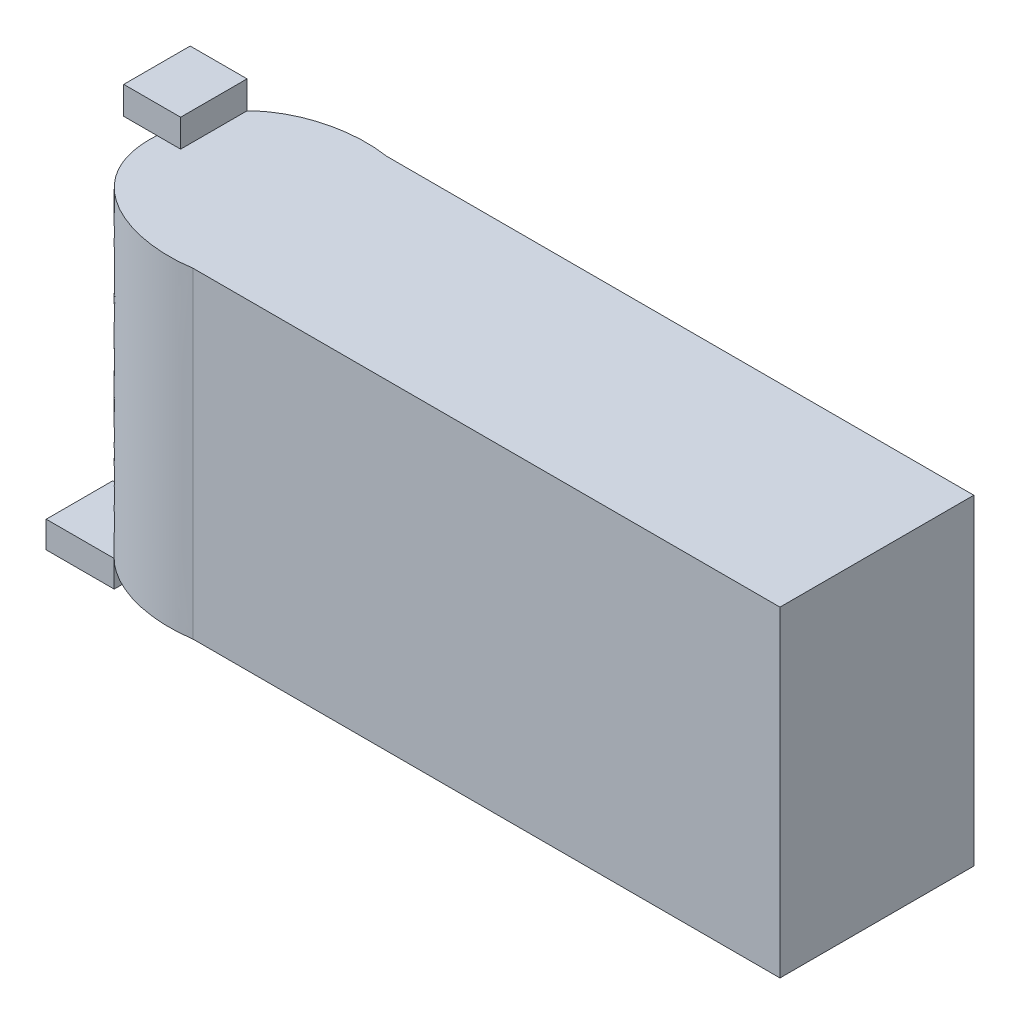
ISO-10303-21;
HEADER;
FILE_DESCRIPTION(('STEP AP214'),'2;1');
FILE_NAME('part.step','',(''),(''),'','','');
FILE_SCHEMA(('AUTOMOTIVE_DESIGN { 1 0 10303 214 1 1 1 1 }'));
ENDSEC;
DATA;
#1=APPLICATION_CONTEXT('core data for automotive mechanical design processes');
#2=APPLICATION_PROTOCOL_DEFINITION('international standard','automotive_design',2000,#1);
#3=PRODUCT_CONTEXT('',#1,'mechanical');
#4=PRODUCT('Part','Part','',(#3));
#5=PRODUCT_RELATED_PRODUCT_CATEGORY('part','',(#4));
#6=PRODUCT_DEFINITION_FORMATION('','',#4);
#7=PRODUCT_DEFINITION_CONTEXT('part definition',#1,'design');
#8=PRODUCT_DEFINITION('design','',#6,#7);
#9=PRODUCT_DEFINITION_SHAPE('','',#8);
#10=(LENGTH_UNIT() NAMED_UNIT(*) SI_UNIT(.MILLI.,.METRE.));
#11=(NAMED_UNIT(*) PLANE_ANGLE_UNIT() SI_UNIT($,.RADIAN.));
#12=(NAMED_UNIT(*) SI_UNIT($,.STERADIAN.) SOLID_ANGLE_UNIT());
#13=UNCERTAINTY_MEASURE_WITH_UNIT(LENGTH_MEASURE(1.E-05),#10,'distance_accuracy_value','');
#14=(GEOMETRIC_REPRESENTATION_CONTEXT(3) GLOBAL_UNCERTAINTY_ASSIGNED_CONTEXT((#13)) GLOBAL_UNIT_ASSIGNED_CONTEXT((#10,
#11,#12)) REPRESENTATION_CONTEXT('',''));
#15=CARTESIAN_POINT('',(0.,0.,0.));
#16=DIRECTION('',(0.,0.,1.));
#17=DIRECTION('',(1.,0.,0.));
#18=AXIS2_PLACEMENT_3D('',#15,#16,#17);
#19=CARTESIAN_POINT('',(0.,0.,0.));
#20=DIRECTION('',(0.,1.,0.));
#21=DIRECTION('',(0.,0.,1.));
#22=AXIS2_PLACEMENT_3D('',#19,#20,#21);
#23=PLANE('',#22);
#24=DIRECTION('',(0.,0.,1.));
#25=VECTOR('',#24,1.);
#26=CARTESIAN_POINT('',(-36.3652336949355,0.,6.));
#27=LINE('',#26,#25);
#28=CARTESIAN_POINT('',(-36.3652336949355,0.,0.));
#29=VERTEX_POINT('',#28);
#30=CARTESIAN_POINT('',(-36.3652336970378,0.,5.99999999789952));
#31=VERTEX_POINT('',#30);
#32=EDGE_CURVE('E475',#29,#31,#27,.T.);
#33=ORIENTED_EDGE('',*,*,#32,.F.);
#34=DIRECTION('',(1.,0.,0.));
#35=VECTOR('',#34,1.);
#36=CARTESIAN_POINT('',(-38.5,0.,0.));
#37=LINE('',#36,#35);
#38=CARTESIAN_POINT('',(-38.5,0.,0.));
#39=VERTEX_POINT('',#38);
#40=EDGE_CURVE('E13',#39,#29,#37,.T.);
#41=ORIENTED_EDGE('',*,*,#40,.F.);
#42=CARTESIAN_POINT('',(-26.5,0.,-8.75));
#43=CARTESIAN_POINT('',(-31.8446124333613,0.,-9.59866238381508));
#44=CARTESIAN_POINT('',(-38.9648011670899,0.,-6.95373195087598));
#45=CARTESIAN_POINT('',(-38.5,0.,0.));
#46=B_SPLINE_CURVE_WITH_KNOTS('',3,(#42,#43,#44,#45),.UNSPECIFIED.,.F.,.F.,(4,4),(0.,1.),.UNSPECIFIED.);
#47=CARTESIAN_POINT('',(-26.5,0.,-8.75));
#48=VERTEX_POINT('',#47);
#49=EDGE_CURVE('E436',#48,#39,#46,.T.);
#50=ORIENTED_EDGE('',*,*,#49,.F.);
#51=DIRECTION('',(1.,0.,0.));
#52=VECTOR('',#51,1.);
#53=CARTESIAN_POINT('',(0.,0.,-8.75));
#54=LINE('',#53,#52);
#55=CARTESIAN_POINT('',(26.5,0.,-8.75));
#56=VERTEX_POINT('',#55);
#57=EDGE_CURVE('E472',#48,#56,#54,.T.);
#58=ORIENTED_EDGE('',*,*,#57,.T.);
#59=DIRECTION('',(0.,0.,-1.));
#60=VECTOR('',#59,1.);
#61=CARTESIAN_POINT('',(26.5,0.,0.));
#62=LINE('',#61,#60);
#63=CARTESIAN_POINT('',(26.5,0.,8.75));
#64=VERTEX_POINT('',#63);
#65=EDGE_CURVE('E473',#64,#56,#62,.T.);
#66=ORIENTED_EDGE('',*,*,#65,.F.);
#67=DIRECTION('',(1.,0.,0.));
#68=VECTOR('',#67,1.);
#69=CARTESIAN_POINT('',(0.,0.,8.75));
#70=LINE('',#69,#68);
#71=CARTESIAN_POINT('',(-26.5,0.,8.75));
#72=VERTEX_POINT('',#71);
#73=EDGE_CURVE('E210',#72,#64,#70,.T.);
#74=ORIENTED_EDGE('',*,*,#73,.F.);
#75=CARTESIAN_POINT('',(-26.5,0.,8.75));
#76=CARTESIAN_POINT('',(-31.8446124333612,0.,9.59866238381507));
#77=CARTESIAN_POINT('',(-38.96480116709,0.,6.95373195087599));
#78=CARTESIAN_POINT('',(-38.5,0.,0.));
#79=B_SPLINE_CURVE_WITH_KNOTS('',3,(#75,#76,#77,#78),.UNSPECIFIED.,.F.,.F.,(4,4),(0.,1.),.UNSPECIFIED.);
#80=EDGE_CURVE('E215',#72,#31,#79,.T.);
#81=ORIENTED_EDGE('',*,*,#80,.T.);
#82=EDGE_LOOP('',(#33,#41,#50,#58,#66,#74,#81));
#83=FACE_BOUND('',#82,.T.);
#84=ADVANCED_FACE('F48',(#83),#23,.F.);
#85=CARTESIAN_POINT('',(0.,29.,8.75));
#86=DIRECTION('',(0.,0.,-1.));
#87=DIRECTION('',(-1.,0.,0.));
#88=AXIS2_PLACEMENT_3D('',#85,#86,#87);
#89=PLANE('',#88);
#90=ORIENTED_EDGE('',*,*,#73,.T.);
#91=DIRECTION('',(0.,-1.,0.));
#92=VECTOR('',#91,1.);
#93=CARTESIAN_POINT('',(26.5,29.,8.75));
#94=LINE('',#93,#92);
#95=CARTESIAN_POINT('',(26.5,29.,8.75));
#96=VERTEX_POINT('',#95);
#97=EDGE_CURVE('E52',#96,#64,#94,.T.);
#98=ORIENTED_EDGE('',*,*,#97,.F.);
#99=DIRECTION('',(1.,0.,0.));
#100=VECTOR('',#99,1.);
#101=CARTESIAN_POINT('',(0.,29.,8.75));
#102=LINE('',#101,#100);
#103=CARTESIAN_POINT('',(-26.5,29.,8.75));
#104=VERTEX_POINT('',#103);
#105=EDGE_CURVE('E211',#104,#96,#102,.T.);
#106=ORIENTED_EDGE('',*,*,#105,.F.);
#107=DIRECTION('',(0.,-1.,0.));
#108=VECTOR('',#107,1.);
#109=CARTESIAN_POINT('',(-26.5,29.,8.75));
#110=LINE('',#109,#108);
#111=EDGE_CURVE('E431',#104,#72,#110,.T.);
#112=ORIENTED_EDGE('',*,*,#111,.T.);
#113=EDGE_LOOP('',(#90,#98,#106,#112));
#114=FACE_BOUND('',#113,.T.);
#115=ADVANCED_FACE('F50',(#114),#89,.F.);
#116=CARTESIAN_POINT('',(26.5,29.,0.));
#117=DIRECTION('',(-1.,0.,0.));
#118=DIRECTION('',(0.,0.,1.));
#119=AXIS2_PLACEMENT_3D('',#116,#117,#118);
#120=PLANE('',#119);
#121=ORIENTED_EDGE('',*,*,#65,.T.);
#122=DIRECTION('',(0.,-1.,0.));
#123=VECTOR('',#122,1.);
#124=CARTESIAN_POINT('',(26.5,29.,-8.75));
#125=LINE('',#124,#123);
#126=CARTESIAN_POINT('',(26.5,29.,-8.75));
#127=VERTEX_POINT('',#126);
#128=EDGE_CURVE('E451',#127,#56,#125,.T.);
#129=ORIENTED_EDGE('',*,*,#128,.F.);
#130=DIRECTION('',(0.,0.,-1.));
#131=VECTOR('',#130,1.);
#132=CARTESIAN_POINT('',(26.5,29.,0.));
#133=LINE('',#132,#131);
#134=EDGE_CURVE('E214',#96,#127,#133,.T.);
#135=ORIENTED_EDGE('',*,*,#134,.F.);
#136=ORIENTED_EDGE('',*,*,#97,.T.);
#137=EDGE_LOOP('',(#121,#129,#135,#136));
#138=FACE_BOUND('',#137,.T.);
#139=ADVANCED_FACE('F242',(#138),#120,.F.);
#140=CARTESIAN_POINT('',(0.,29.,-8.75));
#141=DIRECTION('',(0.,0.,-1.));
#142=DIRECTION('',(-1.,0.,0.));
#143=AXIS2_PLACEMENT_3D('',#140,#141,#142);
#144=PLANE('',#143);
#145=ORIENTED_EDGE('',*,*,#57,.F.);
#146=DIRECTION('',(0.,-1.,0.));
#147=VECTOR('',#146,1.);
#148=CARTESIAN_POINT('',(-26.5,29.,-8.75));
#149=LINE('',#148,#147);
#150=CARTESIAN_POINT('',(-26.5,29.,-8.75));
#151=VERTEX_POINT('',#150);
#152=EDGE_CURVE('E450',#151,#48,#149,.T.);
#153=ORIENTED_EDGE('',*,*,#152,.F.);
#154=DIRECTION('',(1.,0.,0.));
#155=VECTOR('',#154,1.);
#156=CARTESIAN_POINT('',(0.,29.,-8.75));
#157=LINE('',#156,#155);
#158=EDGE_CURVE('E217',#151,#127,#157,.T.);
#159=ORIENTED_EDGE('',*,*,#158,.T.);
#160=ORIENTED_EDGE('',*,*,#128,.T.);
#161=EDGE_LOOP('',(#145,#153,#159,#160));
#162=FACE_BOUND('',#161,.T.);
#163=ADVANCED_FACE('F239',(#162),#144,.T.);
#164=CARTESIAN_POINT('',(-26.5,29.,-8.75));
#165=CARTESIAN_POINT('',(-31.8446124333613,29.,-9.59866238381508));
#166=CARTESIAN_POINT('',(-38.9648011670899,29.,-6.95373195087598));
#167=CARTESIAN_POINT('',(-38.5,29.,0.));
#168=B_SPLINE_CURVE_WITH_KNOTS('',3,(#164,#165,#166,#167),.UNSPECIFIED.,.F.,.F.,(4,4),(0.,1.),.UNSPECIFIED.);
#169=DIRECTION('',(0.,-1.,0.));
#170=VECTOR('',#169,1.);
#171=SURFACE_OF_LINEAR_EXTRUSION('',#168,#170);
#172=ORIENTED_EDGE('',*,*,#49,.T.);
#173=DIRECTION('',(0.,-1.,0.));
#174=VECTOR('',#173,1.);
#175=CARTESIAN_POINT('',(-38.5,29.,0.));
#176=LINE('',#175,#174);
#177=CARTESIAN_POINT('',(-38.5,29.,0.));
#178=VERTEX_POINT('',#177);
#179=EDGE_CURVE('E448',#178,#39,#176,.T.);
#180=ORIENTED_EDGE('',*,*,#179,.F.);
#181=CARTESIAN_POINT('',(-36.3652336970377,29.,-5.99999999789952));
#182=VERTEX_POINT('',#181);
#183=EDGE_CURVE('E74',#182,#178,#168,.T.);
#184=ORIENTED_EDGE('',*,*,#183,.F.);
#185=EDGE_CURVE('E220',#151,#182,#168,.T.);
#186=ORIENTED_EDGE('',*,*,#185,.F.);
#187=ORIENTED_EDGE('',*,*,#152,.T.);
#188=EDGE_LOOP('',(#172,#180,#184,#186,#187));
#189=FACE_BOUND('',#188,.T.);
#190=ADVANCED_FACE('F234',(#189),#171,.F.);
#191=CARTESIAN_POINT('',(-26.5,29.,8.75));
#192=CARTESIAN_POINT('',(-31.8446124333612,29.,9.59866238381507));
#193=CARTESIAN_POINT('',(-38.96480116709,29.,6.95373195087599));
#194=CARTESIAN_POINT('',(-38.5,29.,0.));
#195=B_SPLINE_CURVE_WITH_KNOTS('',3,(#191,#192,#193,#194),.UNSPECIFIED.,.F.,.F.,(4,4),(0.,1.),.UNSPECIFIED.);
#196=DIRECTION('',(0.,-1.,0.));
#197=VECTOR('',#196,1.);
#198=SURFACE_OF_LINEAR_EXTRUSION('',#195,#197);
#199=ORIENTED_EDGE('',*,*,#80,.F.);
#200=ORIENTED_EDGE('',*,*,#111,.F.);
#201=EDGE_CURVE('E225',#104,#178,#195,.T.);
#202=ORIENTED_EDGE('',*,*,#201,.T.);
#203=ORIENTED_EDGE('',*,*,#179,.T.);
#204=EDGE_CURVE('E66',#31,#39,#79,.T.);
#205=ORIENTED_EDGE('',*,*,#204,.F.);
#206=EDGE_LOOP('',(#199,#200,#202,#203,#205));
#207=FACE_BOUND('',#206,.T.);
#208=ADVANCED_FACE('F238',(#207),#198,.T.);
#209=CARTESIAN_POINT('',(0.,29.,0.));
#210=DIRECTION('',(0.,1.,0.));
#211=DIRECTION('',(0.,0.,1.));
#212=AXIS2_PLACEMENT_3D('',#209,#210,#211);
#213=PLANE('',#212);
#214=DIRECTION('',(0.,0.,-1.));
#215=VECTOR('',#214,1.);
#216=CARTESIAN_POINT('',(-36.3652336949354,29.,-6.));
#217=LINE('',#216,#215);
#218=CARTESIAN_POINT('',(-36.3652336949354,29.,0.));
#219=VERTEX_POINT('',#218);
#220=EDGE_CURVE('E173',#219,#182,#217,.T.);
#221=ORIENTED_EDGE('',*,*,#220,.F.);
#222=DIRECTION('',(1.,0.,0.));
#223=VECTOR('',#222,1.);
#224=CARTESIAN_POINT('',(-38.5,29.,0.));
#225=LINE('',#224,#223);
#226=EDGE_CURVE('E57',#178,#219,#225,.T.);
#227=ORIENTED_EDGE('',*,*,#226,.F.);
#228=ORIENTED_EDGE('',*,*,#201,.F.);
#229=ORIENTED_EDGE('',*,*,#105,.T.);
#230=ORIENTED_EDGE('',*,*,#134,.T.);
#231=ORIENTED_EDGE('',*,*,#158,.F.);
#232=ORIENTED_EDGE('',*,*,#185,.T.);
#233=EDGE_LOOP('',(#221,#227,#228,#229,#230,#231,#232));
#234=FACE_BOUND('',#233,.T.);
#235=ADVANCED_FACE('F256',(#234),#213,.T.);
#236=CARTESIAN_POINT('',(-36.3652336949354,31.5,-6.));
#237=DIRECTION('',(-1.,0.,0.));
#238=DIRECTION('',(0.,0.,1.));
#239=AXIS2_PLACEMENT_3D('',#236,#237,#238);
#240=PLANE('',#239);
#241=ORIENTED_EDGE('',*,*,#220,.T.);
#242=DIRECTION('',(0.,-1.,0.));
#243=VECTOR('',#242,1.);
#244=CARTESIAN_POINT('',(-36.3652336949354,31.5,-6.));
#245=LINE('',#244,#243);
#246=CARTESIAN_POINT('',(-36.3652336949354,31.5,-6.));
#247=VERTEX_POINT('',#246);
#248=EDGE_CURVE('E204',#247,#182,#245,.T.);
#249=ORIENTED_EDGE('',*,*,#248,.F.);
#250=DIRECTION('',(0.,0.,-1.));
#251=VECTOR('',#250,1.);
#252=CARTESIAN_POINT('',(-36.3652336949354,31.5,-6.));
#253=LINE('',#252,#251);
#254=CARTESIAN_POINT('',(-36.3652336949354,31.5,0.));
#255=VERTEX_POINT('',#254);
#256=EDGE_CURVE('E185',#255,#247,#253,.T.);
#257=ORIENTED_EDGE('',*,*,#256,.F.);
#258=DIRECTION('',(0.,-1.,0.));
#259=VECTOR('',#258,1.);
#260=CARTESIAN_POINT('',(-36.3652336949354,31.5,0.));
#261=LINE('',#260,#259);
#262=EDGE_CURVE('E207',#255,#219,#261,.T.);
#263=ORIENTED_EDGE('',*,*,#262,.T.);
#264=EDGE_LOOP('',(#241,#249,#257,#263));
#265=FACE_BOUND('',#264,.T.);
#266=ADVANCED_FACE('F259',(#265),#240,.F.);
#267=CARTESIAN_POINT('',(-38.5,31.5,-6.));
#268=DIRECTION('',(0.,0.,1.));
#269=DIRECTION('',(1.,0.,0.));
#270=AXIS2_PLACEMENT_3D('',#267,#268,#269);
#271=PLANE('',#270);
#272=DIRECTION('',(-1.,0.,0.));
#273=VECTOR('',#272,1.);
#274=CARTESIAN_POINT('',(-38.5,29.,-6.));
#275=LINE('',#274,#273);
#276=CARTESIAN_POINT('',(-41.5,29.,-6.));
#277=VERTEX_POINT('',#276);
#278=EDGE_CURVE('E176',#182,#277,#275,.T.);
#279=ORIENTED_EDGE('',*,*,#278,.T.);
#280=DIRECTION('',(0.,-1.,0.));
#281=VECTOR('',#280,1.);
#282=CARTESIAN_POINT('',(-41.5,31.5,-6.));
#283=LINE('',#282,#281);
#284=CARTESIAN_POINT('',(-41.5,31.5,-6.));
#285=VERTEX_POINT('',#284);
#286=EDGE_CURVE('E201',#285,#277,#283,.T.);
#287=ORIENTED_EDGE('',*,*,#286,.F.);
#288=DIRECTION('',(-1.,0.,0.));
#289=VECTOR('',#288,1.);
#290=CARTESIAN_POINT('',(-38.5,31.5,-6.));
#291=LINE('',#290,#289);
#292=EDGE_CURVE('E188',#247,#285,#291,.T.);
#293=ORIENTED_EDGE('',*,*,#292,.F.);
#294=ORIENTED_EDGE('',*,*,#248,.T.);
#295=EDGE_LOOP('',(#279,#287,#293,#294));
#296=FACE_BOUND('',#295,.T.);
#297=ADVANCED_FACE('F263',(#296),#271,.F.);
#298=CARTESIAN_POINT('',(-41.5,31.5,0.));
#299=DIRECTION('',(1.,0.,0.));
#300=DIRECTION('',(0.,0.,-1.));
#301=AXIS2_PLACEMENT_3D('',#298,#299,#300);
#302=PLANE('',#301);
#303=DIRECTION('',(0.,0.,1.));
#304=VECTOR('',#303,1.);
#305=CARTESIAN_POINT('',(-41.5,29.,0.));
#306=LINE('',#305,#304);
#307=CARTESIAN_POINT('',(-41.5,29.,0.));
#308=VERTEX_POINT('',#307);
#309=EDGE_CURVE('E195',#277,#308,#306,.T.);
#310=ORIENTED_EDGE('',*,*,#309,.T.);
#311=DIRECTION('',(0.,-1.,0.));
#312=VECTOR('',#311,1.);
#313=CARTESIAN_POINT('',(-41.5,31.5,0.));
#314=LINE('',#313,#312);
#315=CARTESIAN_POINT('',(-41.5,31.5,0.));
#316=VERTEX_POINT('',#315);
#317=EDGE_CURVE('E192',#316,#308,#314,.T.);
#318=ORIENTED_EDGE('',*,*,#317,.F.);
#319=DIRECTION('',(0.,0.,1.));
#320=VECTOR('',#319,1.);
#321=CARTESIAN_POINT('',(-41.5,31.5,0.));
#322=LINE('',#321,#320);
#323=EDGE_CURVE('E190',#285,#316,#322,.T.);
#324=ORIENTED_EDGE('',*,*,#323,.F.);
#325=ORIENTED_EDGE('',*,*,#286,.T.);
#326=EDGE_LOOP('',(#310,#318,#324,#325));
#327=FACE_BOUND('',#326,.T.);
#328=ADVANCED_FACE('F267',(#327),#302,.F.);
#329=CARTESIAN_POINT('',(-38.5,31.5,0.));
#330=DIRECTION('',(0.,0.,-1.));
#331=DIRECTION('',(-1.,0.,0.));
#332=AXIS2_PLACEMENT_3D('',#329,#330,#331);
#333=PLANE('',#332);
#334=EDGE_CURVE('E186',#308,#178,#225,.T.);
#335=ORIENTED_EDGE('',*,*,#334,.T.);
#336=ORIENTED_EDGE('',*,*,#226,.T.);
#337=ORIENTED_EDGE('',*,*,#262,.F.);
#338=DIRECTION('',(1.,0.,0.));
#339=VECTOR('',#338,1.);
#340=CARTESIAN_POINT('',(-36.3652336949354,31.5,0.));
#341=LINE('',#340,#339);
#342=EDGE_CURVE('E182',#316,#255,#341,.T.);
#343=ORIENTED_EDGE('',*,*,#342,.F.);
#344=ORIENTED_EDGE('',*,*,#317,.T.);
#345=EDGE_LOOP('',(#335,#336,#337,#343,#344));
#346=FACE_BOUND('',#345,.T.);
#347=ADVANCED_FACE('F271',(#346),#333,.F.);
#348=CARTESIAN_POINT('',(0.,31.5,0.));
#349=DIRECTION('',(0.,-1.,0.));
#350=DIRECTION('',(0.,0.,-1.));
#351=AXIS2_PLACEMENT_3D('',#348,#349,#350);
#352=PLANE('',#351);
#353=ORIENTED_EDGE('',*,*,#342,.T.);
#354=ORIENTED_EDGE('',*,*,#256,.T.);
#355=ORIENTED_EDGE('',*,*,#292,.T.);
#356=ORIENTED_EDGE('',*,*,#323,.T.);
#357=EDGE_LOOP('',(#353,#354,#355,#356));
#358=FACE_BOUND('',#357,.T.);
#359=ADVANCED_FACE('F275',(#358),#352,.F.);
#360=CARTESIAN_POINT('',(0.,29.,0.));
#361=DIRECTION('',(0.,-1.,0.));
#362=DIRECTION('',(0.,0.,-1.));
#363=AXIS2_PLACEMENT_3D('',#360,#361,#362);
#364=PLANE('',#363);
#365=ORIENTED_EDGE('',*,*,#278,.F.);
#366=ORIENTED_EDGE('',*,*,#183,.T.);
#367=ORIENTED_EDGE('',*,*,#334,.F.);
#368=ORIENTED_EDGE('',*,*,#309,.F.);
#369=EDGE_LOOP('',(#365,#366,#367,#368));
#370=FACE_BOUND('',#369,.T.);
#371=ADVANCED_FACE('F277',(#370),#364,.T.);
#372=CARTESIAN_POINT('',(-36.3652336949355,-2.4,6.));
#373=DIRECTION('',(-1.,0.,0.));
#374=DIRECTION('',(0.,0.,1.));
#375=AXIS2_PLACEMENT_3D('',#372,#373,#374);
#376=PLANE('',#375);
#377=ORIENTED_EDGE('',*,*,#32,.T.);
#378=DIRECTION('',(0.,1.,0.));
#379=VECTOR('',#378,1.);
#380=CARTESIAN_POINT('',(-36.3652336949355,-2.4,6.));
#381=LINE('',#380,#379);
#382=CARTESIAN_POINT('',(-36.3652336949355,-2.4,6.));
#383=VERTEX_POINT('',#382);
#384=EDGE_CURVE('E157',#383,#31,#381,.T.);
#385=ORIENTED_EDGE('',*,*,#384,.F.);
#386=DIRECTION('',(0.,0.,1.));
#387=VECTOR('',#386,1.);
#388=CARTESIAN_POINT('',(-36.3652336949355,-2.4,6.));
#389=LINE('',#388,#387);
#390=CARTESIAN_POINT('',(-36.3652336949355,-2.4,0.));
#391=VERTEX_POINT('',#390);
#392=EDGE_CURVE('E150',#391,#383,#389,.T.);
#393=ORIENTED_EDGE('',*,*,#392,.F.);
#394=DIRECTION('',(0.,1.,0.));
#395=VECTOR('',#394,1.);
#396=CARTESIAN_POINT('',(-36.3652336949355,-2.4,0.));
#397=LINE('',#396,#395);
#398=EDGE_CURVE('E155',#391,#29,#397,.T.);
#399=ORIENTED_EDGE('',*,*,#398,.T.);
#400=EDGE_LOOP('',(#377,#385,#393,#399));
#401=FACE_BOUND('',#400,.T.);
#402=ADVANCED_FACE('F153',(#401),#376,.F.);
#403=CARTESIAN_POINT('',(-38.5,-2.4,6.));
#404=DIRECTION('',(0.,0.,-1.));
#405=DIRECTION('',(-1.,0.,0.));
#406=AXIS2_PLACEMENT_3D('',#403,#404,#405);
#407=PLANE('',#406);
#408=DIRECTION('',(-1.,0.,0.));
#409=VECTOR('',#408,1.);
#410=CARTESIAN_POINT('',(-38.5,0.,6.));
#411=LINE('',#410,#409);
#412=CARTESIAN_POINT('',(-42.5,0.,6.));
#413=VERTEX_POINT('',#412);
#414=EDGE_CURVE('E476',#31,#413,#411,.T.);
#415=ORIENTED_EDGE('',*,*,#414,.T.);
#416=DIRECTION('',(0.,1.,0.));
#417=VECTOR('',#416,1.);
#418=CARTESIAN_POINT('',(-42.5,-2.4,6.));
#419=LINE('',#418,#417);
#420=CARTESIAN_POINT('',(-42.5,-2.4,6.));
#421=VERTEX_POINT('',#420);
#422=EDGE_CURVE('E178',#421,#413,#419,.T.);
#423=ORIENTED_EDGE('',*,*,#422,.F.);
#424=DIRECTION('',(-1.,0.,0.));
#425=VECTOR('',#424,1.);
#426=CARTESIAN_POINT('',(-38.5,-2.4,6.));
#427=LINE('',#426,#425);
#428=EDGE_CURVE('E160',#383,#421,#427,.T.);
#429=ORIENTED_EDGE('',*,*,#428,.F.);
#430=ORIENTED_EDGE('',*,*,#384,.T.);
#431=EDGE_LOOP('',(#415,#423,#429,#430));
#432=FACE_BOUND('',#431,.T.);
#433=ADVANCED_FACE('F286',(#432),#407,.F.);
#434=CARTESIAN_POINT('',(-42.5,-2.4,0.));
#435=DIRECTION('',(1.,0.,0.));
#436=DIRECTION('',(0.,0.,-1.));
#437=AXIS2_PLACEMENT_3D('',#434,#435,#436);
#438=PLANE('',#437);
#439=DIRECTION('',(0.,0.,-1.));
#440=VECTOR('',#439,1.);
#441=CARTESIAN_POINT('',(-42.5,0.,0.));
#442=LINE('',#441,#440);
#443=CARTESIAN_POINT('',(-42.5,0.,0.));
#444=VERTEX_POINT('',#443);
#445=EDGE_CURVE('E478',#413,#444,#442,.T.);
#446=ORIENTED_EDGE('',*,*,#445,.T.);
#447=DIRECTION('',(0.,1.,0.));
#448=VECTOR('',#447,1.);
#449=CARTESIAN_POINT('',(-42.5,-2.4,0.));
#450=LINE('',#449,#448);
#451=CARTESIAN_POINT('',(-42.5,-2.4,0.));
#452=VERTEX_POINT('',#451);
#453=EDGE_CURVE('E484',#452,#444,#450,.T.);
#454=ORIENTED_EDGE('',*,*,#453,.F.);
#455=DIRECTION('',(0.,0.,-1.));
#456=VECTOR('',#455,1.);
#457=CARTESIAN_POINT('',(-42.5,-2.4,0.));
#458=LINE('',#457,#456);
#459=EDGE_CURVE('E166',#421,#452,#458,.T.);
#460=ORIENTED_EDGE('',*,*,#459,.F.);
#461=ORIENTED_EDGE('',*,*,#422,.T.);
#462=EDGE_LOOP('',(#446,#454,#460,#461));
#463=FACE_BOUND('',#462,.T.);
#464=ADVANCED_FACE('F289',(#463),#438,.F.);
#465=CARTESIAN_POINT('',(-38.5,-2.4,0.));
#466=DIRECTION('',(0.,0.,1.));
#467=DIRECTION('',(1.,0.,0.));
#468=AXIS2_PLACEMENT_3D('',#465,#466,#467);
#469=PLANE('',#468);
#470=EDGE_CURVE('E59',#444,#39,#37,.T.);
#471=ORIENTED_EDGE('',*,*,#470,.T.);
#472=ORIENTED_EDGE('',*,*,#40,.T.);
#473=ORIENTED_EDGE('',*,*,#398,.F.);
#474=DIRECTION('',(1.,0.,0.));
#475=VECTOR('',#474,1.);
#476=CARTESIAN_POINT('',(-36.3652336949355,-2.4,0.));
#477=LINE('',#476,#475);
#478=EDGE_CURVE('E161',#452,#391,#477,.T.);
#479=ORIENTED_EDGE('',*,*,#478,.F.);
#480=ORIENTED_EDGE('',*,*,#453,.T.);
#481=EDGE_LOOP('',(#471,#472,#473,#479,#480));
#482=FACE_BOUND('',#481,.T.);
#483=ADVANCED_FACE('F172',(#482),#469,.F.);
#484=CARTESIAN_POINT('',(0.,-2.4,0.));
#485=DIRECTION('',(0.,1.,0.));
#486=DIRECTION('',(0.,0.,1.));
#487=AXIS2_PLACEMENT_3D('',#484,#485,#486);
#488=PLANE('',#487);
#489=ORIENTED_EDGE('',*,*,#478,.T.);
#490=ORIENTED_EDGE('',*,*,#392,.T.);
#491=ORIENTED_EDGE('',*,*,#428,.T.);
#492=ORIENTED_EDGE('',*,*,#459,.T.);
#493=EDGE_LOOP('',(#489,#490,#491,#492));
#494=FACE_BOUND('',#493,.T.);
#495=ADVANCED_FACE('F164',(#494),#488,.F.);
#496=CARTESIAN_POINT('',(0.,0.,0.));
#497=DIRECTION('',(0.,1.,0.));
#498=DIRECTION('',(0.,0.,1.));
#499=AXIS2_PLACEMENT_3D('',#496,#497,#498);
#500=PLANE('',#499);
#501=ORIENTED_EDGE('',*,*,#414,.F.);
#502=ORIENTED_EDGE('',*,*,#204,.T.);
#503=ORIENTED_EDGE('',*,*,#470,.F.);
#504=ORIENTED_EDGE('',*,*,#445,.F.);
#505=EDGE_LOOP('',(#501,#502,#503,#504));
#506=FACE_BOUND('',#505,.T.);
#507=ADVANCED_FACE('F296',(#506),#500,.T.);
#508=CLOSED_SHELL('',(#84,#115,#139,#163,#190,#208,#235,#266,#297,#328,#347,#359,#371,#402,#433,
#464,#483,#495,#507));
#509=MANIFOLD_SOLID_BREP('B2',#508);
#510=ADVANCED_BREP_SHAPE_REPRESENTATION('',(#18,#509),#14);
#511=SHAPE_DEFINITION_REPRESENTATION(#9,#510);
ENDSEC;
END-ISO-10303-21;
